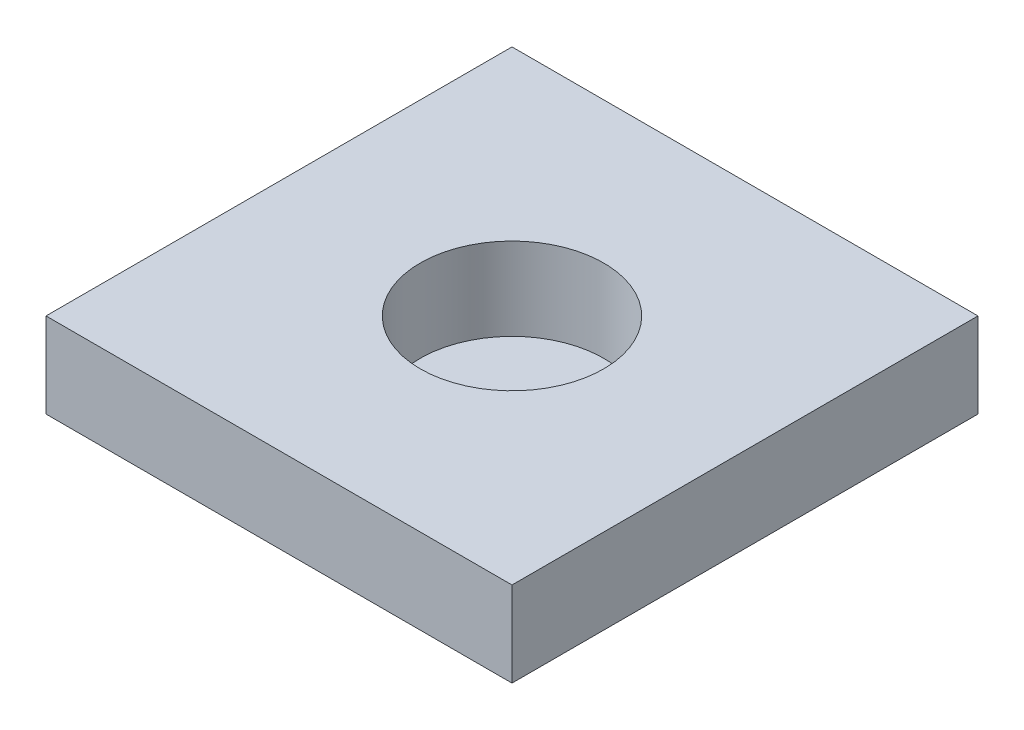
ISO-10303-21;
HEADER;
FILE_DESCRIPTION(('STEP AP214'),'2;1');
FILE_NAME('part.step','',(''),(''),'','','');
FILE_SCHEMA(('AUTOMOTIVE_DESIGN { 1 0 10303 214 1 1 1 1 }'));
ENDSEC;
DATA;
#1=APPLICATION_CONTEXT('core data for automotive mechanical design processes');
#2=APPLICATION_PROTOCOL_DEFINITION('international standard','automotive_design',2000,#1);
#3=PRODUCT_CONTEXT('',#1,'mechanical');
#4=PRODUCT('Part','Part','',(#3));
#5=PRODUCT_RELATED_PRODUCT_CATEGORY('part','',(#4));
#6=PRODUCT_DEFINITION_FORMATION('','',#4);
#7=PRODUCT_DEFINITION_CONTEXT('part definition',#1,'design');
#8=PRODUCT_DEFINITION('design','',#6,#7);
#9=PRODUCT_DEFINITION_SHAPE('','',#8);
#10=(LENGTH_UNIT() NAMED_UNIT(*) SI_UNIT(.MILLI.,.METRE.));
#11=(NAMED_UNIT(*) PLANE_ANGLE_UNIT() SI_UNIT($,.RADIAN.));
#12=(NAMED_UNIT(*) SI_UNIT($,.STERADIAN.) SOLID_ANGLE_UNIT());
#13=UNCERTAINTY_MEASURE_WITH_UNIT(LENGTH_MEASURE(1.E-05),#10,'distance_accuracy_value','');
#14=(GEOMETRIC_REPRESENTATION_CONTEXT(3) GLOBAL_UNCERTAINTY_ASSIGNED_CONTEXT((#13)) GLOBAL_UNIT_ASSIGNED_CONTEXT((#10,
#11,#12)) REPRESENTATION_CONTEXT('',''));
#15=CARTESIAN_POINT('',(0.,0.,0.));
#16=DIRECTION('',(0.,0.,1.));
#17=DIRECTION('',(1.,0.,0.));
#18=AXIS2_PLACEMENT_3D('',#15,#16,#17);
#19=CARTESIAN_POINT('',(0.,0.8,0.));
#20=DIRECTION('',(0.,0.,-1.));
#21=DIRECTION('',(-1.,0.,0.));
#22=AXIS2_PLACEMENT_3D('',#19,#20,#21);
#23=PLANE('',#22);
#24=DIRECTION('',(1.,0.,0.));
#25=VECTOR('',#24,1.);
#26=CARTESIAN_POINT('',(0.,0.,0.));
#27=LINE('',#26,#25);
#28=CARTESIAN_POINT('',(0.,0.,0.));
#29=VERTEX_POINT('',#28);
#30=CARTESIAN_POINT('',(152.4,0.,0.));
#31=VERTEX_POINT('',#30);
#32=EDGE_CURVE('E120',#29,#31,#27,.T.);
#33=ORIENTED_EDGE('',*,*,#32,.T.);
#34=DIRECTION('',(0.,-1.,0.));
#35=VECTOR('',#34,1.);
#36=CARTESIAN_POINT('',(152.4,0.8,0.));
#37=LINE('',#36,#35);
#38=CARTESIAN_POINT('',(152.4,27.8,0.));
#39=VERTEX_POINT('',#38);
#40=EDGE_CURVE('E11',#39,#31,#37,.T.);
#41=ORIENTED_EDGE('',*,*,#40,.F.);
#42=DIRECTION('',(1.,0.,0.));
#43=VECTOR('',#42,1.);
#44=CARTESIAN_POINT('',(0.,27.8,0.));
#45=LINE('',#44,#43);
#46=CARTESIAN_POINT('',(0.,27.8,0.));
#47=VERTEX_POINT('',#46);
#48=EDGE_CURVE('E94',#47,#39,#45,.T.);
#49=ORIENTED_EDGE('',*,*,#48,.F.);
#50=DIRECTION('',(0.,-1.,0.));
#51=VECTOR('',#50,1.);
#52=CARTESIAN_POINT('',(0.,0.8,0.));
#53=LINE('',#52,#51);
#54=EDGE_CURVE('E61',#47,#29,#53,.T.);
#55=ORIENTED_EDGE('',*,*,#54,.T.);
#56=EDGE_LOOP('',(#33,#41,#49,#55));
#57=FACE_BOUND('',#56,.T.);
#58=ADVANCED_FACE('F45',(#57),#23,.F.);
#59=CARTESIAN_POINT('',(152.4,0.8,0.));
#60=DIRECTION('',(-1.,0.,0.));
#61=DIRECTION('',(0.,0.,1.));
#62=AXIS2_PLACEMENT_3D('',#59,#60,#61);
#63=PLANE('',#62);
#64=DIRECTION('',(0.,0.,-1.));
#65=VECTOR('',#64,1.);
#66=CARTESIAN_POINT('',(152.4,0.,0.));
#67=LINE('',#66,#65);
#68=CARTESIAN_POINT('',(152.4,0.,-152.4));
#69=VERTEX_POINT('',#68);
#70=EDGE_CURVE('E123',#31,#69,#67,.T.);
#71=ORIENTED_EDGE('',*,*,#70,.T.);
#72=DIRECTION('',(0.,-1.,0.));
#73=VECTOR('',#72,1.);
#74=CARTESIAN_POINT('',(152.4,0.8,-152.4));
#75=LINE('',#74,#73);
#76=CARTESIAN_POINT('',(152.4,27.8,-152.4));
#77=VERTEX_POINT('',#76);
#78=EDGE_CURVE('E54',#77,#69,#75,.T.);
#79=ORIENTED_EDGE('',*,*,#78,.F.);
#80=DIRECTION('',(0.,0.,-1.));
#81=VECTOR('',#80,1.);
#82=CARTESIAN_POINT('',(152.4,27.8,-152.4));
#83=LINE('',#82,#81);
#84=EDGE_CURVE('E99',#39,#77,#83,.T.);
#85=ORIENTED_EDGE('',*,*,#84,.F.);
#86=ORIENTED_EDGE('',*,*,#40,.T.);
#87=EDGE_LOOP('',(#71,#79,#85,#86));
#88=FACE_BOUND('',#87,.T.);
#89=ADVANCED_FACE('F139',(#88),#63,.F.);
#90=CARTESIAN_POINT('',(0.,0.8,-152.4));
#91=DIRECTION('',(0.,0.,-1.));
#92=DIRECTION('',(-1.,0.,0.));
#93=AXIS2_PLACEMENT_3D('',#90,#91,#92);
#94=PLANE('',#93);
#95=DIRECTION('',(1.,0.,0.));
#96=VECTOR('',#95,1.);
#97=CARTESIAN_POINT('',(0.,0.,-152.4));
#98=LINE('',#97,#96);
#99=CARTESIAN_POINT('',(0.,0.,-152.4));
#100=VERTEX_POINT('',#99);
#101=EDGE_CURVE('E127',#100,#69,#98,.T.);
#102=ORIENTED_EDGE('',*,*,#101,.F.);
#103=DIRECTION('',(0.,-1.,0.));
#104=VECTOR('',#103,1.);
#105=CARTESIAN_POINT('',(0.,0.8,-152.4));
#106=LINE('',#105,#104);
#107=CARTESIAN_POINT('',(0.,27.8,-152.4));
#108=VERTEX_POINT('',#107);
#109=EDGE_CURVE('E69',#108,#100,#106,.T.);
#110=ORIENTED_EDGE('',*,*,#109,.F.);
#111=DIRECTION('',(-1.,0.,0.));
#112=VECTOR('',#111,1.);
#113=CARTESIAN_POINT('',(0.,27.8,-152.4));
#114=LINE('',#113,#112);
#115=EDGE_CURVE('E104',#77,#108,#114,.T.);
#116=ORIENTED_EDGE('',*,*,#115,.F.);
#117=ORIENTED_EDGE('',*,*,#78,.T.);
#118=EDGE_LOOP('',(#102,#110,#116,#117));
#119=FACE_BOUND('',#118,.T.);
#120=ADVANCED_FACE('F137',(#119),#94,.T.);
#121=CARTESIAN_POINT('',(0.,0.8,0.));
#122=DIRECTION('',(-1.,0.,0.));
#123=DIRECTION('',(0.,0.,1.));
#124=AXIS2_PLACEMENT_3D('',#121,#122,#123);
#125=PLANE('',#124);
#126=DIRECTION('',(0.,0.,-1.));
#127=VECTOR('',#126,1.);
#128=CARTESIAN_POINT('',(0.,0.,0.));
#129=LINE('',#128,#127);
#130=EDGE_CURVE('E90',#29,#100,#129,.T.);
#131=ORIENTED_EDGE('',*,*,#130,.F.);
#132=ORIENTED_EDGE('',*,*,#54,.F.);
#133=DIRECTION('',(0.,0.,1.));
#134=VECTOR('',#133,1.);
#135=CARTESIAN_POINT('',(0.,27.8,-152.4));
#136=LINE('',#135,#134);
#137=EDGE_CURVE('E88',#108,#47,#136,.T.);
#138=ORIENTED_EDGE('',*,*,#137,.F.);
#139=ORIENTED_EDGE('',*,*,#109,.T.);
#140=EDGE_LOOP('',(#131,#132,#138,#139));
#141=FACE_BOUND('',#140,.T.);
#142=ADVANCED_FACE('F86',(#141),#125,.T.);
#143=CARTESIAN_POINT('',(0.,0.,0.));
#144=DIRECTION('',(0.,1.,0.));
#145=DIRECTION('',(0.,0.,1.));
#146=AXIS2_PLACEMENT_3D('',#143,#144,#145);
#147=PLANE('',#146);
#148=CARTESIAN_POINT('',(76.2,0.,-76.2));
#149=DIRECTION('',(0.,1.,0.));
#150=DIRECTION('',(0.,0.,1.));
#151=AXIS2_PLACEMENT_3D('',#148,#149,#150);
#152=CIRCLE('',#151,5.25);
#153=CARTESIAN_POINT('',(76.2,0.,-70.95));
#154=VERTEX_POINT('',#153);
#155=EDGE_CURVE('E48',#154,#154,#152,.T.);
#156=ORIENTED_EDGE('',*,*,#155,.T.);
#157=EDGE_LOOP('',(#156));
#158=FACE_BOUND('',#157,.T.);
#159=ORIENTED_EDGE('',*,*,#32,.F.);
#160=ORIENTED_EDGE('',*,*,#130,.T.);
#161=ORIENTED_EDGE('',*,*,#101,.T.);
#162=ORIENTED_EDGE('',*,*,#70,.F.);
#163=EDGE_LOOP('',(#159,#160,#161,#162));
#164=FACE_BOUND('',#163,.T.);
#165=ADVANCED_FACE('F141',(#158,#164),#147,.F.);
#166=CARTESIAN_POINT('',(76.2,-253.2,-76.2));
#167=DIRECTION('',(0.,1.,0.));
#168=DIRECTION('',(0.,0.,1.));
#169=AXIS2_PLACEMENT_3D('',#166,#167,#168);
#170=CYLINDRICAL_SURFACE('',#169,5.25);
#171=CARTESIAN_POINT('',(76.2,0.8,-76.2));
#172=DIRECTION('',(0.,1.,0.));
#173=DIRECTION('',(0.,0.,1.));
#174=AXIS2_PLACEMENT_3D('',#171,#172,#173);
#175=CIRCLE('',#174,5.25);
#176=CARTESIAN_POINT('',(76.2,0.8,-70.95));
#177=VERTEX_POINT('',#176);
#178=EDGE_CURVE('E106',#177,#177,#175,.T.);
#179=ORIENTED_EDGE('',*,*,#178,.T.);
#180=EDGE_LOOP('',(#179));
#181=FACE_BOUND('',#180,.T.);
#182=ORIENTED_EDGE('',*,*,#155,.F.);
#183=EDGE_LOOP('',(#182));
#184=FACE_BOUND('',#183,.T.);
#185=ADVANCED_FACE('F143',(#181,#184),#170,.F.);
#186=CARTESIAN_POINT('',(0.,27.8,0.));
#187=DIRECTION('',(0.,1.,0.));
#188=DIRECTION('',(0.,0.,1.));
#189=AXIS2_PLACEMENT_3D('',#186,#187,#188);
#190=PLANE('',#189);
#191=CARTESIAN_POINT('',(76.2,27.8,-76.2));
#192=DIRECTION('',(0.,1.,0.));
#193=DIRECTION('',(0.,0.,1.));
#194=AXIS2_PLACEMENT_3D('',#191,#192,#193);
#195=CIRCLE('',#194,30.);
#196=CARTESIAN_POINT('',(76.2,27.8,-46.2));
#197=VERTEX_POINT('',#196);
#198=EDGE_CURVE('E113',#197,#197,#195,.T.);
#199=ORIENTED_EDGE('',*,*,#198,.F.);
#200=EDGE_LOOP('',(#199));
#201=FACE_BOUND('',#200,.T.);
#202=ORIENTED_EDGE('',*,*,#137,.T.);
#203=ORIENTED_EDGE('',*,*,#48,.T.);
#204=ORIENTED_EDGE('',*,*,#84,.T.);
#205=ORIENTED_EDGE('',*,*,#115,.T.);
#206=EDGE_LOOP('',(#202,#203,#204,#205));
#207=FACE_BOUND('',#206,.T.);
#208=ADVANCED_FACE('F102',(#201,#207),#190,.T.);
#209=CARTESIAN_POINT('',(76.2,0.799999999999999,-76.2));
#210=DIRECTION('',(0.,1.,0.));
#211=DIRECTION('',(0.,0.,1.));
#212=AXIS2_PLACEMENT_3D('',#209,#210,#211);
#213=CYLINDRICAL_SURFACE('',#212,30.);
#214=CARTESIAN_POINT('',(76.2,0.799999999999999,-76.2));
#215=DIRECTION('',(0.,1.,0.));
#216=DIRECTION('',(0.,0.,1.));
#217=AXIS2_PLACEMENT_3D('',#214,#215,#216);
#218=CIRCLE('',#217,30.);
#219=CARTESIAN_POINT('',(76.2,0.799999999999999,-46.2));
#220=VERTEX_POINT('',#219);
#221=EDGE_CURVE('E110',#220,#220,#218,.T.);
#222=ORIENTED_EDGE('',*,*,#221,.F.);
#223=EDGE_LOOP('',(#222));
#224=FACE_BOUND('',#223,.T.);
#225=ORIENTED_EDGE('',*,*,#198,.T.);
#226=EDGE_LOOP('',(#225));
#227=FACE_BOUND('',#226,.T.);
#228=ADVANCED_FACE('F174',(#224,#227),#213,.F.);
#229=CARTESIAN_POINT('',(76.2,0.799999999999999,-76.2));
#230=DIRECTION('',(0.,1.,0.));
#231=DIRECTION('',(0.,0.,1.));
#232=AXIS2_PLACEMENT_3D('',#229,#230,#231);
#233=PLANE('',#232);
#234=ORIENTED_EDGE('',*,*,#178,.F.);
#235=EDGE_LOOP('',(#234));
#236=FACE_BOUND('',#235,.T.);
#237=ORIENTED_EDGE('',*,*,#221,.T.);
#238=EDGE_LOOP('',(#237));
#239=FACE_BOUND('',#238,.T.);
#240=ADVANCED_FACE('F182',(#236,#239),#233,.T.);
#241=CLOSED_SHELL('',(#58,#89,#120,#142,#165,#185,#208,#228,#240));
#242=MANIFOLD_SOLID_BREP('B2',#241);
#243=ADVANCED_BREP_SHAPE_REPRESENTATION('',(#18,#242),#14);
#244=SHAPE_DEFINITION_REPRESENTATION(#9,#243);
ENDSEC;
END-ISO-10303-21;
